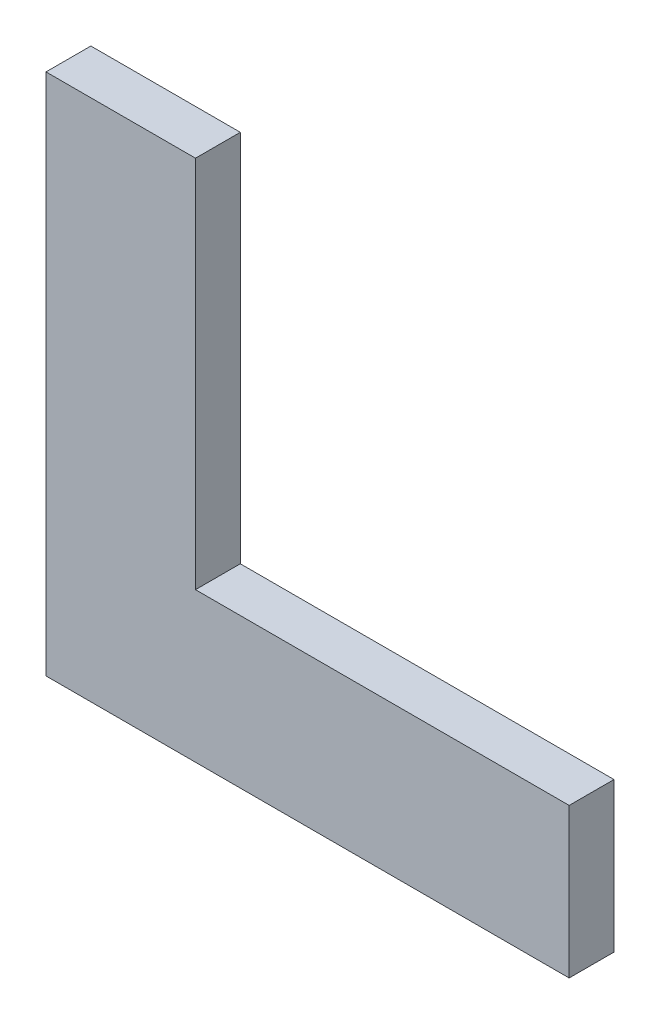
ISO-10303-21;
HEADER;
FILE_DESCRIPTION(('STEP AP214'),'2;1');
FILE_NAME('part.step','',(''),(''),'','','');
FILE_SCHEMA(('AUTOMOTIVE_DESIGN { 1 0 10303 214 1 1 1 1 }'));
ENDSEC;
DATA;
#1=APPLICATION_CONTEXT('core data for automotive mechanical design processes');
#2=APPLICATION_PROTOCOL_DEFINITION('international standard','automotive_design',2000,#1);
#3=PRODUCT_CONTEXT('',#1,'mechanical');
#4=PRODUCT('Part','Part','',(#3));
#5=PRODUCT_RELATED_PRODUCT_CATEGORY('part','',(#4));
#6=PRODUCT_DEFINITION_FORMATION('','',#4);
#7=PRODUCT_DEFINITION_CONTEXT('part definition',#1,'design');
#8=PRODUCT_DEFINITION('design','',#6,#7);
#9=PRODUCT_DEFINITION_SHAPE('','',#8);
#10=(LENGTH_UNIT() NAMED_UNIT(*) SI_UNIT(.MILLI.,.METRE.));
#11=(NAMED_UNIT(*) PLANE_ANGLE_UNIT() SI_UNIT($,.RADIAN.));
#12=(NAMED_UNIT(*) SI_UNIT($,.STERADIAN.) SOLID_ANGLE_UNIT());
#13=UNCERTAINTY_MEASURE_WITH_UNIT(LENGTH_MEASURE(1.E-05),#10,'distance_accuracy_value','');
#14=(GEOMETRIC_REPRESENTATION_CONTEXT(3) GLOBAL_UNCERTAINTY_ASSIGNED_CONTEXT((#13)) GLOBAL_UNIT_ASSIGNED_CONTEXT((#10,
#11,#12)) REPRESENTATION_CONTEXT('',''));
#15=CARTESIAN_POINT('',(0.,0.,0.));
#16=DIRECTION('',(0.,0.,1.));
#17=DIRECTION('',(1.,0.,0.));
#18=AXIS2_PLACEMENT_3D('',#15,#16,#17);
#19=CARTESIAN_POINT('',(31.8954198473283,0.,7.62));
#20=DIRECTION('',(1.,0.,0.));
#21=DIRECTION('',(0.,1.,0.));
#22=AXIS2_PLACEMENT_3D('',#19,#20,#21);
#23=PLANE('',#22);
#24=DIRECTION('',(0.,-1.,0.));
#25=VECTOR('',#24,1.);
#26=CARTESIAN_POINT('',(31.8954198473283,0.,0.));
#27=LINE('',#26,#25);
#28=CARTESIAN_POINT('',(31.8954198473283,-38.0515267175572,0.));
#29=VERTEX_POINT('',#28);
#30=CARTESIAN_POINT('',(31.8954198473282,-63.4515267175572,0.));
#31=VERTEX_POINT('',#30);
#32=EDGE_CURVE('E128',#29,#31,#27,.T.);
#33=ORIENTED_EDGE('',*,*,#32,.F.);
#34=DIRECTION('',(0.,0.,-1.));
#35=VECTOR('',#34,1.);
#36=CARTESIAN_POINT('',(31.8954198473283,-38.0515267175572,7.62));
#37=LINE('',#36,#35);
#38=CARTESIAN_POINT('',(31.8954198473283,-38.0515267175572,7.62));
#39=VERTEX_POINT('',#38);
#40=EDGE_CURVE('E12',#39,#29,#37,.T.);
#41=ORIENTED_EDGE('',*,*,#40,.F.);
#42=DIRECTION('',(0.,-1.,0.));
#43=VECTOR('',#42,1.);
#44=CARTESIAN_POINT('',(31.8954198473283,0.,7.62));
#45=LINE('',#44,#43);
#46=CARTESIAN_POINT('',(31.8954198473282,-63.4515267175572,7.62));
#47=VERTEX_POINT('',#46);
#48=EDGE_CURVE('E132',#39,#47,#45,.T.);
#49=ORIENTED_EDGE('',*,*,#48,.T.);
#50=DIRECTION('',(0.,0.,-1.));
#51=VECTOR('',#50,1.);
#52=CARTESIAN_POINT('',(31.8954198473282,-63.4515267175572,7.62));
#53=LINE('',#52,#51);
#54=EDGE_CURVE('E165',#47,#31,#53,.T.);
#55=ORIENTED_EDGE('',*,*,#54,.T.);
#56=EDGE_LOOP('',(#33,#41,#49,#55));
#57=FACE_BOUND('',#56,.T.);
#58=ADVANCED_FACE('F65',(#57),#23,.T.);
#59=CARTESIAN_POINT('',(0.,-38.0515267175572,7.62));
#60=DIRECTION('',(0.,1.,0.));
#61=DIRECTION('',(0.,0.,1.));
#62=AXIS2_PLACEMENT_3D('',#59,#60,#61);
#63=PLANE('',#62);
#64=DIRECTION('',(1.,0.,0.));
#65=VECTOR('',#64,1.);
#66=CARTESIAN_POINT('',(0.,-38.0515267175572,0.));
#67=LINE('',#66,#65);
#68=CARTESIAN_POINT('',(-31.6045801526717,-38.0515267175572,0.));
#69=VERTEX_POINT('',#68);
#70=EDGE_CURVE('E133',#69,#29,#67,.T.);
#71=ORIENTED_EDGE('',*,*,#70,.F.);
#72=DIRECTION('',(0.,0.,-1.));
#73=VECTOR('',#72,1.);
#74=CARTESIAN_POINT('',(-31.6045801526717,-38.0515267175572,7.62));
#75=LINE('',#74,#73);
#76=CARTESIAN_POINT('',(-31.6045801526717,-38.0515267175572,7.62));
#77=VERTEX_POINT('',#76);
#78=EDGE_CURVE('E76',#77,#69,#75,.T.);
#79=ORIENTED_EDGE('',*,*,#78,.F.);
#80=DIRECTION('',(1.,0.,0.));
#81=VECTOR('',#80,1.);
#82=CARTESIAN_POINT('',(0.,-38.0515267175572,7.62));
#83=LINE('',#82,#81);
#84=EDGE_CURVE('E174',#77,#39,#83,.T.);
#85=ORIENTED_EDGE('',*,*,#84,.T.);
#86=ORIENTED_EDGE('',*,*,#40,.T.);
#87=EDGE_LOOP('',(#71,#79,#85,#86));
#88=FACE_BOUND('',#87,.T.);
#89=ADVANCED_FACE('F187',(#88),#63,.T.);
#90=CARTESIAN_POINT('',(0.,-63.4515267175572,7.62));
#91=DIRECTION('',(0.,1.,0.));
#92=DIRECTION('',(0.,0.,1.));
#93=AXIS2_PLACEMENT_3D('',#90,#91,#92);
#94=PLANE('',#93);
#95=DIRECTION('',(1.,0.,0.));
#96=VECTOR('',#95,1.);
#97=CARTESIAN_POINT('',(0.,-63.4515267175572,0.));
#98=LINE('',#97,#96);
#99=CARTESIAN_POINT('',(-57.0045801526717,-63.4515267175572,0.));
#100=VERTEX_POINT('',#99);
#101=EDGE_CURVE('E121',#100,#31,#98,.T.);
#102=ORIENTED_EDGE('',*,*,#101,.T.);
#103=ORIENTED_EDGE('',*,*,#54,.F.);
#104=DIRECTION('',(1.,0.,0.));
#105=VECTOR('',#104,1.);
#106=CARTESIAN_POINT('',(0.,-63.4515267175572,7.62));
#107=LINE('',#106,#105);
#108=CARTESIAN_POINT('',(-57.0045801526717,-63.4515267175572,7.62));
#109=VERTEX_POINT('',#108);
#110=EDGE_CURVE('E85',#109,#47,#107,.T.);
#111=ORIENTED_EDGE('',*,*,#110,.F.);
#112=DIRECTION('',(0.,0.,-1.));
#113=VECTOR('',#112,1.);
#114=CARTESIAN_POINT('',(-57.0045801526717,-63.4515267175572,7.62));
#115=LINE('',#114,#113);
#116=EDGE_CURVE('E137',#109,#100,#115,.T.);
#117=ORIENTED_EDGE('',*,*,#116,.T.);
#118=EDGE_LOOP('',(#102,#103,#111,#117));
#119=FACE_BOUND('',#118,.T.);
#120=ADVANCED_FACE('F142',(#119),#94,.F.);
#121=CARTESIAN_POINT('',(0.,0.,7.62));
#122=DIRECTION('',(0.,0.,1.));
#123=DIRECTION('',(1.,0.,0.));
#124=AXIS2_PLACEMENT_3D('',#121,#122,#123);
#125=PLANE('',#124);
#126=ORIENTED_EDGE('',*,*,#48,.F.);
#127=ORIENTED_EDGE('',*,*,#84,.F.);
#128=DIRECTION('',(0.,-1.,0.));
#129=VECTOR('',#128,1.);
#130=CARTESIAN_POINT('',(-31.6045801526717,25.4484732824428,7.62));
#131=LINE('',#130,#129);
#132=CARTESIAN_POINT('',(-31.6045801526717,25.4484732824428,7.62));
#133=VERTEX_POINT('',#132);
#134=EDGE_CURVE('E139',#133,#77,#131,.T.);
#135=ORIENTED_EDGE('',*,*,#134,.F.);
#136=DIRECTION('',(1.,0.,0.));
#137=VECTOR('',#136,1.);
#138=CARTESIAN_POINT('',(-57.0045801526717,25.4484732824428,7.62));
#139=LINE('',#138,#137);
#140=CARTESIAN_POINT('',(-57.0045801526717,25.4484732824428,7.62));
#141=VERTEX_POINT('',#140);
#142=EDGE_CURVE('E148',#141,#133,#139,.T.);
#143=ORIENTED_EDGE('',*,*,#142,.F.);
#144=DIRECTION('',(0.,-1.,0.));
#145=VECTOR('',#144,1.);
#146=CARTESIAN_POINT('',(-57.0045801526717,25.4484732824428,7.62));
#147=LINE('',#146,#145);
#148=EDGE_CURVE('E144',#141,#109,#147,.T.);
#149=ORIENTED_EDGE('',*,*,#148,.T.);
#150=ORIENTED_EDGE('',*,*,#110,.T.);
#151=EDGE_LOOP('',(#126,#127,#135,#143,#149,#150));
#152=FACE_BOUND('',#151,.T.);
#153=ADVANCED_FACE('F183',(#152),#125,.T.);
#154=CARTESIAN_POINT('',(0.,0.,0.));
#155=DIRECTION('',(0.,0.,1.));
#156=DIRECTION('',(1.,0.,0.));
#157=AXIS2_PLACEMENT_3D('',#154,#155,#156);
#158=PLANE('',#157);
#159=ORIENTED_EDGE('',*,*,#32,.T.);
#160=ORIENTED_EDGE('',*,*,#101,.F.);
#161=DIRECTION('',(0.,-1.,0.));
#162=VECTOR('',#161,1.);
#163=CARTESIAN_POINT('',(-57.0045801526717,25.4484732824428,0.));
#164=LINE('',#163,#162);
#165=CARTESIAN_POINT('',(-57.0045801526717,25.4484732824428,0.));
#166=VERTEX_POINT('',#165);
#167=EDGE_CURVE('E124',#166,#100,#164,.T.);
#168=ORIENTED_EDGE('',*,*,#167,.F.);
#169=DIRECTION('',(1.,0.,0.));
#170=VECTOR('',#169,1.);
#171=CARTESIAN_POINT('',(-57.0045801526717,25.4484732824428,0.));
#172=LINE('',#171,#170);
#173=CARTESIAN_POINT('',(-31.6045801526717,25.4484732824428,0.));
#174=VERTEX_POINT('',#173);
#175=EDGE_CURVE('E140',#166,#174,#172,.T.);
#176=ORIENTED_EDGE('',*,*,#175,.T.);
#177=DIRECTION('',(0.,-1.,0.));
#178=VECTOR('',#177,1.);
#179=CARTESIAN_POINT('',(-31.6045801526717,25.4484732824428,0.));
#180=LINE('',#179,#178);
#181=EDGE_CURVE('E153',#174,#69,#180,.T.);
#182=ORIENTED_EDGE('',*,*,#181,.T.);
#183=ORIENTED_EDGE('',*,*,#70,.T.);
#184=EDGE_LOOP('',(#159,#160,#168,#176,#182,#183));
#185=FACE_BOUND('',#184,.T.);
#186=ADVANCED_FACE('F122',(#185),#158,.F.);
#187=CARTESIAN_POINT('',(-57.0045801526717,25.4484732824428,7.62));
#188=DIRECTION('',(1.,0.,0.));
#189=DIRECTION('',(0.,0.,-1.));
#190=AXIS2_PLACEMENT_3D('',#187,#188,#189);
#191=PLANE('',#190);
#192=ORIENTED_EDGE('',*,*,#167,.T.);
#193=ORIENTED_EDGE('',*,*,#116,.F.);
#194=ORIENTED_EDGE('',*,*,#148,.F.);
#195=DIRECTION('',(0.,0.,-1.));
#196=VECTOR('',#195,1.);
#197=CARTESIAN_POINT('',(-57.0045801526717,25.4484732824428,7.62));
#198=LINE('',#197,#196);
#199=EDGE_CURVE('E115',#141,#166,#198,.T.);
#200=ORIENTED_EDGE('',*,*,#199,.T.);
#201=EDGE_LOOP('',(#192,#193,#194,#200));
#202=FACE_BOUND('',#201,.T.);
#203=ADVANCED_FACE('F136',(#202),#191,.F.);
#204=CARTESIAN_POINT('',(-57.0045801526717,25.4484732824428,7.62));
#205=DIRECTION('',(0.,1.,0.));
#206=DIRECTION('',(-1.,0.,0.));
#207=AXIS2_PLACEMENT_3D('',#204,#205,#206);
#208=PLANE('',#207);
#209=ORIENTED_EDGE('',*,*,#175,.F.);
#210=ORIENTED_EDGE('',*,*,#199,.F.);
#211=ORIENTED_EDGE('',*,*,#142,.T.);
#212=DIRECTION('',(0.,0.,-1.));
#213=VECTOR('',#212,1.);
#214=CARTESIAN_POINT('',(-31.6045801526717,25.4484732824428,7.62));
#215=LINE('',#214,#213);
#216=EDGE_CURVE('E69',#133,#174,#215,.T.);
#217=ORIENTED_EDGE('',*,*,#216,.T.);
#218=EDGE_LOOP('',(#209,#210,#211,#217));
#219=FACE_BOUND('',#218,.T.);
#220=ADVANCED_FACE('F192',(#219),#208,.T.);
#221=CARTESIAN_POINT('',(-31.6045801526717,25.4484732824428,7.62));
#222=DIRECTION('',(1.,0.,0.));
#223=DIRECTION('',(0.,1.,0.));
#224=AXIS2_PLACEMENT_3D('',#221,#222,#223);
#225=PLANE('',#224);
#226=ORIENTED_EDGE('',*,*,#134,.T.);
#227=ORIENTED_EDGE('',*,*,#78,.T.);
#228=ORIENTED_EDGE('',*,*,#181,.F.);
#229=ORIENTED_EDGE('',*,*,#216,.F.);
#230=EDGE_LOOP('',(#226,#227,#228,#229));
#231=FACE_BOUND('',#230,.T.);
#232=ADVANCED_FACE('F67',(#231),#225,.T.);
#233=CLOSED_SHELL('',(#58,#89,#120,#153,#186,#203,#220,#232));
#234=MANIFOLD_SOLID_BREP('B2',#233);
#235=ADVANCED_BREP_SHAPE_REPRESENTATION('',(#18,#234),#14);
#236=SHAPE_DEFINITION_REPRESENTATION(#9,#235);
ENDSEC;
END-ISO-10303-21;
